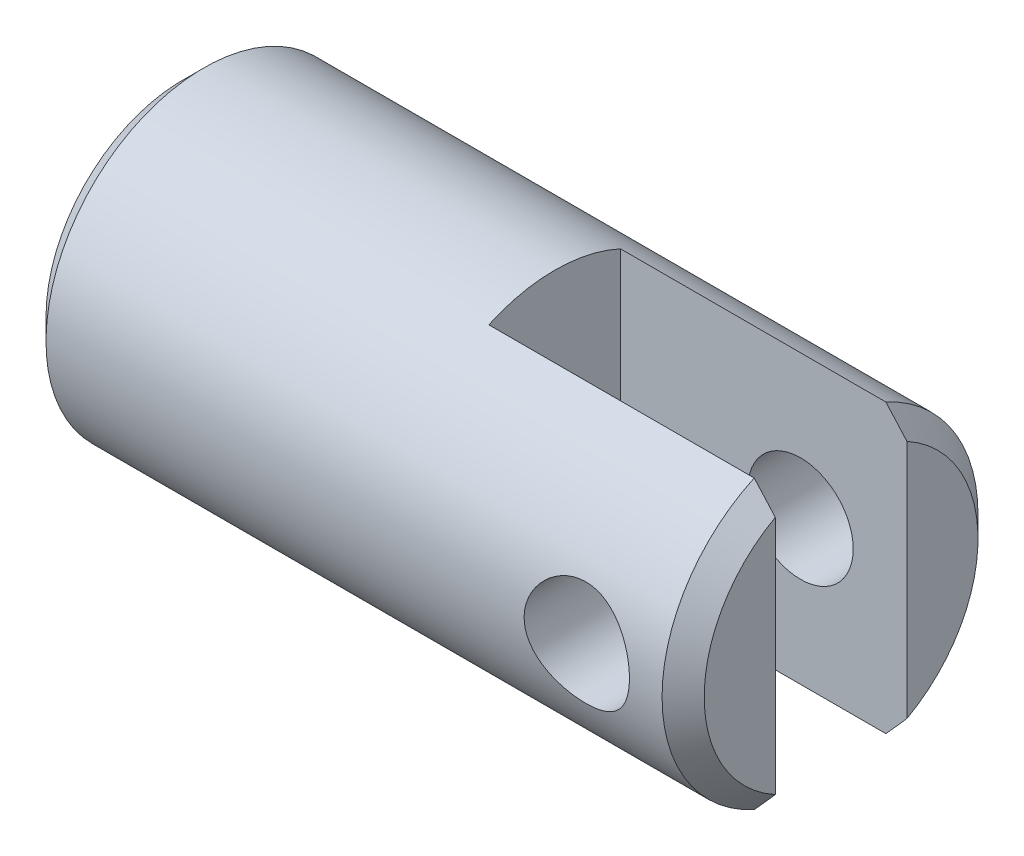
ISO-10303-21;
HEADER;
FILE_DESCRIPTION(('STEP AP214'),'2;1');
FILE_NAME('part.step','',(''),(''),'','','');
FILE_SCHEMA(('AUTOMOTIVE_DESIGN { 1 0 10303 214 1 1 1 1 }'));
ENDSEC;
DATA;
#1=APPLICATION_CONTEXT('core data for automotive mechanical design processes');
#2=APPLICATION_PROTOCOL_DEFINITION('international standard','automotive_design',2000,#1);
#3=PRODUCT_CONTEXT('',#1,'mechanical');
#4=PRODUCT('Part','Part','',(#3));
#5=PRODUCT_RELATED_PRODUCT_CATEGORY('part','',(#4));
#6=PRODUCT_DEFINITION_FORMATION('','',#4);
#7=PRODUCT_DEFINITION_CONTEXT('part definition',#1,'design');
#8=PRODUCT_DEFINITION('design','',#6,#7);
#9=PRODUCT_DEFINITION_SHAPE('','',#8);
#10=(LENGTH_UNIT() NAMED_UNIT(*) SI_UNIT(.MILLI.,.METRE.));
#11=(NAMED_UNIT(*) PLANE_ANGLE_UNIT() SI_UNIT($,.RADIAN.));
#12=(NAMED_UNIT(*) SI_UNIT($,.STERADIAN.) SOLID_ANGLE_UNIT());
#13=UNCERTAINTY_MEASURE_WITH_UNIT(LENGTH_MEASURE(1.E-05),#10,'distance_accuracy_value','');
#14=(GEOMETRIC_REPRESENTATION_CONTEXT(3) GLOBAL_UNCERTAINTY_ASSIGNED_CONTEXT((#13)) GLOBAL_UNIT_ASSIGNED_CONTEXT((#10,
#11,#12)) REPRESENTATION_CONTEXT('',''));
#15=CARTESIAN_POINT('',(0.,0.,0.));
#16=DIRECTION('',(0.,0.,1.));
#17=DIRECTION('',(1.,0.,0.));
#18=AXIS2_PLACEMENT_3D('',#15,#16,#17);
#19=CARTESIAN_POINT('',(39.6875,0.,0.));
#20=DIRECTION('',(1.,0.,0.));
#21=DIRECTION('',(0.,0.,-1.));
#22=AXIS2_PLACEMENT_3D('',#19,#20,#21);
#23=PLANE('',#22);
#24=DIRECTION('',(0.,1.,0.));
#25=VECTOR('',#24,1.);
#26=CARTESIAN_POINT('',(39.6875,-8.6587902409921,-3.96875));
#27=LINE('',#26,#25);
#28=CARTESIAN_POINT('',(39.6875,-7.238373328138,-3.96875));
#29=VERTEX_POINT('',#28);
#30=CARTESIAN_POINT('',(39.6875,7.238373328138,-3.96875));
#31=VERTEX_POINT('',#30);
#32=EDGE_CURVE('E114',#29,#31,#27,.T.);
#33=ORIENTED_EDGE('',*,*,#32,.F.);
#34=CARTESIAN_POINT('',(39.6875,0.,0.));
#35=DIRECTION('',(1.,0.,0.));
#36=DIRECTION('',(0.,0.,-1.));
#37=AXIS2_PLACEMENT_3D('',#34,#35,#36);
#38=CIRCLE('',#37,8.25499999999998);
#39=EDGE_CURVE('E208',#29,#31,#38,.T.);
#40=ORIENTED_EDGE('',*,*,#39,.T.);
#41=EDGE_LOOP('',(#33,#40));
#42=FACE_BOUND('',#41,.T.);
#43=ADVANCED_FACE('F34',(#42),#23,.T.);
#44=CARTESIAN_POINT('',(39.6875,0.,0.));
#45=DIRECTION('',(-1.,0.,0.));
#46=DIRECTION('',(0.,0.,1.));
#47=AXIS2_PLACEMENT_3D('',#44,#45,#46);
#48=CYLINDRICAL_SURFACE('',#47,9.525);
#49=CARTESIAN_POINT('',(1.27000000000001,0.,0.));
#50=DIRECTION('',(1.,0.,0.));
#51=DIRECTION('',(0.,0.,-1.));
#52=AXIS2_PLACEMENT_3D('',#49,#50,#51);
#53=CIRCLE('',#52,9.525);
#54=CARTESIAN_POINT('',(1.27000000000001,0.,-9.525));
#55=VERTEX_POINT('',#54);
#56=EDGE_CURVE('E133',#55,#55,#53,.T.);
#57=ORIENTED_EDGE('',*,*,#56,.T.);
#58=EDGE_LOOP('',(#57));
#59=FACE_BOUND('',#58,.T.);
#60=CARTESIAN_POINT('',(36.449,0.,-9.525));
#61=CARTESIAN_POINT('',(36.449000805598,0.173238677165346,-9.52500048580498));
#62=CARTESIAN_POINT('',(36.4347751550461,0.346472492659895,-9.52023018186455));
#63=CARTESIAN_POINT('',(36.3784225795053,0.687837590771685,-9.50167042395416));
#64=CARTESIAN_POINT('',(36.3362927579622,0.855968341777245,-9.48788003366834));
#65=CARTESIAN_POINT('',(36.2257364022556,1.18215660666814,-9.45277852602955));
#66=CARTESIAN_POINT('',(36.1573538266918,1.34023044718816,-9.43147998545459));
#67=CARTESIAN_POINT('',(35.9964317762382,1.6426654243569,-9.3835361515256));
#68=CARTESIAN_POINT('',(35.9038875361167,1.78702384834389,-9.35688980370195));
#69=CARTESIAN_POINT('',(35.6939030695735,2.06292981819569,-9.30002249856541));
#70=CARTESIAN_POINT('',(35.5757758312229,2.19393674844713,-9.26971591772517));
#71=CARTESIAN_POINT('',(35.3194392838066,2.43469379932912,-9.20941499436411));
#72=CARTESIAN_POINT('',(35.181225564102,2.54443923892904,-9.17942072197493));
#73=CARTESIAN_POINT('',(34.8837722592512,2.74264419157345,-9.12219830615344));
#74=CARTESIAN_POINT('',(34.7240423763505,2.83040092485178,-9.0950744970031));
#75=CARTESIAN_POINT('',(34.3910409000941,2.97757492456176,-9.04796594704059));
#76=CARTESIAN_POINT('',(34.2177734580083,3.03700083920298,-9.02797902810367));
#77=CARTESIAN_POINT('',(33.8687625217479,3.12379824029159,-8.99830887880273));
#78=CARTESIAN_POINT('',(33.6932993630472,3.15218269826286,-8.98830104068516));
#79=CARTESIAN_POINT('',(33.3398375805551,3.17925806658696,-8.97876209798686));
#80=CARTESIAN_POINT('',(33.1618397572483,3.17795815259498,-8.97922775597168));
#81=CARTESIAN_POINT('',(32.8170011983402,3.14648819425835,-8.99029872650972));
#82=CARTESIAN_POINT('',(32.6500223207321,3.1176401743052,-9.00043970379417));
#83=CARTESIAN_POINT('',(32.3234258927483,3.03404956704689,-9.02895888275449));
#84=CARTESIAN_POINT('',(32.1638092262436,2.97930387942919,-9.04733807064542));
#85=CARTESIAN_POINT('',(31.853464520047,2.84460650934116,-9.09059367841715));
#86=CARTESIAN_POINT('',(31.7029210191343,2.76426310464555,-9.11556996393148));
#87=CARTESIAN_POINT('',(31.4170348662119,2.58092291251246,-9.16916373477931));
#88=CARTESIAN_POINT('',(31.2816966219865,2.47791958175572,-9.19778227084722));
#89=CARTESIAN_POINT('',(31.0226341758395,2.2458341312661,-9.25726270107577));
#90=CARTESIAN_POINT('',(30.8998851949337,2.11567125149229,-9.28816371201626));
#91=CARTESIAN_POINT('',(30.6777032283437,1.83622813465495,-9.34742029378842));
#92=CARTESIAN_POINT('',(30.5782724788277,1.68694606622309,-9.37577562033364));
#93=CARTESIAN_POINT('',(30.4047642467537,1.3714336714219,-9.42711817702495));
#94=CARTESIAN_POINT('',(30.3309480649932,1.20504990262187,-9.45004936275525));
#95=CARTESIAN_POINT('',(30.2126549226906,0.861279339682312,-9.4875530068358));
#96=CARTESIAN_POINT('',(30.1681677705306,0.683896391141978,-9.50212836854242));
#97=CARTESIAN_POINT('',(30.111523260379,0.331418658755541,-9.52079715951823));
#98=CARTESIAN_POINT('',(30.0980481058765,0.156557979570887,-9.52531755822087));
#99=CARTESIAN_POINT('',(30.1000562386751,-0.192960847123753,-9.52464766056077));
#100=CARTESIAN_POINT('',(30.1155346379361,-0.367619023839889,-9.51945900331475));
#101=CARTESIAN_POINT('',(30.1739678070617,-0.706500575516011,-9.50023578476806));
#102=CARTESIAN_POINT('',(30.2161137042071,-0.870879661700629,-9.48646180908036));
#103=CARTESIAN_POINT('',(30.3256741861819,-1.19016766849015,-9.45171613685472));
#104=CARTESIAN_POINT('',(30.3930919933102,-1.34507537851482,-9.43074352248193));
#105=CARTESIAN_POINT('',(30.5532486210945,-1.64556534104864,-9.38304356837145));
#106=CARTESIAN_POINT('',(30.6466068336741,-1.79079512051444,-9.35617936849621));
#107=CARTESIAN_POINT('',(30.8552664262928,-2.06395583568048,-9.29974181184133));
#108=CARTESIAN_POINT('',(30.9705745079009,-2.19188146775095,-9.27016762910402));
#109=CARTESIAN_POINT('',(31.2260575344459,-2.432851712285,-9.20993992337912));
#110=CARTESIAN_POINT('',(31.3671242954928,-2.54495607735532,-9.17929841452584));
#111=CARTESIAN_POINT('',(31.6667247277996,-2.74401763337735,-9.121774152107));
#112=CARTESIAN_POINT('',(31.8252585446632,-2.83097461468096,-9.09489142987857));
#113=CARTESIAN_POINT('',(32.1553618235454,-2.97687025407194,-9.04819093937643));
#114=CARTESIAN_POINT('',(32.3269041013608,-3.03586556962394,-9.02835890517708));
#115=CARTESIAN_POINT('',(32.6783022138901,-3.12386556696095,-8.99829392572977));
#116=CARTESIAN_POINT('',(32.8581542651588,-3.15288375947876,-8.98805665630055));
#117=CARTESIAN_POINT('',(33.2111257799299,-3.17905219686556,-8.97883201925513));
#118=CARTESIAN_POINT('',(33.3841164304107,-3.17776306695416,-8.97929370817293));
#119=CARTESIAN_POINT('',(33.7272791128775,-3.1471942816996,-8.99005281690779));
#120=CARTESIAN_POINT('',(33.8974513120074,-3.11791629228101,-9.00034965132723));
#121=CARTESIAN_POINT('',(34.2269307300328,-3.03330550668567,-9.02920864668031));
#122=CARTESIAN_POINT('',(34.3863829193893,-2.97847812359925,-9.04761011221366));
#123=CARTESIAN_POINT('',(34.693947017029,-2.84473448628719,-9.09054566248638));
#124=CARTESIAN_POINT('',(34.8420563990219,-2.76581288515833,-9.11508110823773));
#125=CARTESIAN_POINT('',(35.1297356520052,-2.58210269895239,-9.16885482792697));
#126=CARTESIAN_POINT('',(35.2686508935274,-2.47633567077755,-9.19825159463785));
#127=CARTESIAN_POINT('',(35.5272651574948,-2.24359115395569,-9.25777156199328));
#128=CARTESIAN_POINT('',(35.6469587278096,-2.11660766813346,-9.28789496596782));
#129=CARTESIAN_POINT('',(35.8684335090181,-1.83909194322319,-9.34688346918603));
#130=CARTESIAN_POINT('',(35.9693348041094,-1.68783480536164,-9.3756537721899));
#131=CARTESIAN_POINT('',(36.1441696116008,-1.36955960976603,-9.42740021973043));
#132=CARTESIAN_POINT('',(36.2181100183025,-1.2025455950702,-9.45037784507677));
#133=CARTESIAN_POINT('',(36.3338161831515,-0.865167329863096,-9.4870751034262));
#134=CARTESIAN_POINT('',(36.3768718303862,-0.695286130622597,-9.50116249441509));
#135=CARTESIAN_POINT('',(36.4344593911499,-0.350267320832535,-9.52012342428904));
#136=CARTESIAN_POINT('',(36.4489991856015,-0.17513117618077,-9.52499950888798));
#137=CARTESIAN_POINT('',(36.449,0.,-9.525));
#138=B_SPLINE_CURVE_WITH_KNOTS('',3,(#60,#61,#62,#63,#64,#65,#66,#67,#68,#69,#70,#71,#72,#73,
#74,#75,#76,#77,#78,#79,#80,#81,#82,#83,#84,#85,#86,#87,#88,#89,#90,#91,#92,#93,#94,#95,#96,#97,
#98,#99,#100,#101,#102,#103,#104,#105,#106,#107,#108,#109,#110,#111,#112,#113,#114,#115,#116,
#117,#118,#119,#120,#121,#122,#123,#124,#125,#126,#127,#128,#129,#130,#131,#132,#133,#134,#135,
#136,#137),.UNSPECIFIED.,.T.,.F.,(4,2,2,2,2,2,2,2,2,2,2,2,2,2,2,2,2,2,2,2,2,2,2,2,2,2,2,2,2,2,2,
2,2,2,2,2,2,2,4),(0.,0.519071561632583,1.03819701322438,1.55645698636311,2.07481924951214,
2.6093637259775,3.14402575687909,3.69406121814519,4.24392866899746,4.77526114230341,
5.30642937910266,5.81332424300315,6.32027980466156,6.8353994341754,7.35066800622307,
7.89283745951089,8.43505888444012,8.98265937939884,9.53006948685135,10.0537512658116,
10.5773446429626,11.0857715158083,11.5942632377703,12.1161301950386,12.638156741095,
13.1839024764639,13.7296527614611,14.2742924389999,14.8186865394104,15.3351123975402,
15.8515075194062,16.3580948898032,16.8647947620873,17.3936046174648,17.92256420318,
18.4721392315144,19.0215736265905,19.5464607283686,20.0712027467109),.UNSPECIFIED.);
#139=CARTESIAN_POINT('',(36.449,0.,-9.525));
#140=VERTEX_POINT('',#139);
#141=EDGE_CURVE('E187',#140,#140,#138,.T.);
#142=ORIENTED_EDGE('',*,*,#141,.T.);
#143=EDGE_LOOP('',(#142));
#144=FACE_BOUND('',#143,.T.);
#145=CARTESIAN_POINT('',(36.449,0.,9.52499999999999));
#146=CARTESIAN_POINT('',(36.449000805598,-0.173238677165346,9.52500048580497));
#147=CARTESIAN_POINT('',(36.4347751550461,-0.346472492659896,9.52023018186455));
#148=CARTESIAN_POINT('',(36.3784225795053,-0.687837590771687,9.50167042395417));
#149=CARTESIAN_POINT('',(36.3362927579622,-0.855968341777246,9.48788003366834));
#150=CARTESIAN_POINT('',(36.2257364022556,-1.18215660666814,9.45277852602955));
#151=CARTESIAN_POINT('',(36.1573538266918,-1.34023044718816,9.43147998545459));
#152=CARTESIAN_POINT('',(35.9964317762382,-1.64266542435691,9.3835361515256));
#153=CARTESIAN_POINT('',(35.9038875361167,-1.78702384834389,9.35688980370195));
#154=CARTESIAN_POINT('',(35.6939030695735,-2.0629298181957,9.30002249856541));
#155=CARTESIAN_POINT('',(35.5757758312229,-2.19393674844713,9.26971591772517));
#156=CARTESIAN_POINT('',(35.3194392838066,-2.43469379932912,9.20941499436411));
#157=CARTESIAN_POINT('',(35.181225564102,-2.54443923892904,9.17942072197493));
#158=CARTESIAN_POINT('',(34.8837722592512,-2.74264419157345,9.12219830615344));
#159=CARTESIAN_POINT('',(34.7240423763505,-2.83040092485178,9.0950744970031));
#160=CARTESIAN_POINT('',(34.3910409000941,-2.97757492456176,9.04796594704059));
#161=CARTESIAN_POINT('',(34.2177734580083,-3.03700083920298,9.02797902810367));
#162=CARTESIAN_POINT('',(33.8687625217479,-3.12379824029159,8.99830887880273));
#163=CARTESIAN_POINT('',(33.6932993630472,-3.15218269826286,8.98830104068516));
#164=CARTESIAN_POINT('',(33.3398375805551,-3.17925806658696,8.97876209798686));
#165=CARTESIAN_POINT('',(33.1618397572483,-3.17795815259498,8.97922775597168));
#166=CARTESIAN_POINT('',(32.8170011983402,-3.14648819425835,8.99029872650972));
#167=CARTESIAN_POINT('',(32.6500223207321,-3.1176401743052,9.00043970379417));
#168=CARTESIAN_POINT('',(32.3234258927483,-3.03404956704689,9.02895888275449));
#169=CARTESIAN_POINT('',(32.1638092262436,-2.97930387942919,9.04733807064542));
#170=CARTESIAN_POINT('',(31.853464520047,-2.84460650934116,9.09059367841715));
#171=CARTESIAN_POINT('',(31.7029210191343,-2.76426310464555,9.11556996393148));
#172=CARTESIAN_POINT('',(31.4170348662119,-2.58092291251246,9.16916373477932));
#173=CARTESIAN_POINT('',(31.2816966219865,-2.47791958175571,9.19778227084722));
#174=CARTESIAN_POINT('',(31.0226341758395,-2.2458341312661,9.25726270107577));
#175=CARTESIAN_POINT('',(30.8998851949337,-2.11567125149229,9.28816371201626));
#176=CARTESIAN_POINT('',(30.6777032283437,-1.83622813465495,9.34742029378842));
#177=CARTESIAN_POINT('',(30.5782724788277,-1.68694606622308,9.37577562033364));
#178=CARTESIAN_POINT('',(30.4047642467537,-1.3714336714219,9.42711817702495));
#179=CARTESIAN_POINT('',(30.3309480649932,-1.20504990262187,9.45004936275525));
#180=CARTESIAN_POINT('',(30.2126549226906,-0.861279339682311,9.4875530068358));
#181=CARTESIAN_POINT('',(30.1681677705306,-0.683896391141977,9.50212836854242));
#182=CARTESIAN_POINT('',(30.111523260379,-0.331418658755539,9.52079715951823));
#183=CARTESIAN_POINT('',(30.0980481058765,-0.156557979570885,9.52531755822087));
#184=CARTESIAN_POINT('',(30.1000562386751,0.192960847123755,9.52464766056077));
#185=CARTESIAN_POINT('',(30.1155346379361,0.367619023839891,9.51945900331475));
#186=CARTESIAN_POINT('',(30.1739678070617,0.706500575516013,9.50023578476806));
#187=CARTESIAN_POINT('',(30.2161137042071,0.87087966170063,9.48646180908036));
#188=CARTESIAN_POINT('',(30.3256741861819,1.19016766849015,9.45171613685472));
#189=CARTESIAN_POINT('',(30.3930919933102,1.34507537851483,9.43074352248193));
#190=CARTESIAN_POINT('',(30.5532486210945,1.64556534104864,9.38304356837145));
#191=CARTESIAN_POINT('',(30.6466068336741,1.79079512051444,9.35617936849621));
#192=CARTESIAN_POINT('',(30.8552664262928,2.06395583568049,9.29974181184133));
#193=CARTESIAN_POINT('',(30.9705745079009,2.19188146775096,9.27016762910402));
#194=CARTESIAN_POINT('',(31.2260575344459,2.432851712285,9.20993992337912));
#195=CARTESIAN_POINT('',(31.3671242954928,2.54495607735532,9.17929841452584));
#196=CARTESIAN_POINT('',(31.6667247277996,2.74401763337735,9.121774152107));
#197=CARTESIAN_POINT('',(31.8252585446632,2.83097461468096,9.09489142987857));
#198=CARTESIAN_POINT('',(32.1553618235454,2.97687025407194,9.04819093937643));
#199=CARTESIAN_POINT('',(32.3269041013608,3.03586556962394,9.02835890517708));
#200=CARTESIAN_POINT('',(32.6783022138901,3.12386556696095,8.99829392572977));
#201=CARTESIAN_POINT('',(32.8581542651588,3.15288375947876,8.98805665630055));
#202=CARTESIAN_POINT('',(33.2111257799299,3.17905219686556,8.97883201925513));
#203=CARTESIAN_POINT('',(33.3841164304107,3.17776306695416,8.97929370817293));
#204=CARTESIAN_POINT('',(33.7272791128775,3.1471942816996,8.99005281690779));
#205=CARTESIAN_POINT('',(33.8974513120074,3.11791629228101,9.00034965132723));
#206=CARTESIAN_POINT('',(34.2269307300328,3.03330550668567,9.02920864668031));
#207=CARTESIAN_POINT('',(34.3863829193893,2.97847812359925,9.04761011221366));
#208=CARTESIAN_POINT('',(34.693947017029,2.84473448628719,9.09054566248638));
#209=CARTESIAN_POINT('',(34.8420563990219,2.76581288515833,9.11508110823773));
#210=CARTESIAN_POINT('',(35.1297356520052,2.58210269895239,9.16885482792697));
#211=CARTESIAN_POINT('',(35.2686508935274,2.47633567077754,9.19825159463785));
#212=CARTESIAN_POINT('',(35.5272651574948,2.24359115395568,9.25777156199328));
#213=CARTESIAN_POINT('',(35.6469587278096,2.11660766813345,9.28789496596782));
#214=CARTESIAN_POINT('',(35.8684335090181,1.83909194322319,9.34688346918603));
#215=CARTESIAN_POINT('',(35.9693348041094,1.68783480536164,9.3756537721899));
#216=CARTESIAN_POINT('',(36.1441696116008,1.36955960976603,9.42740021973043));
#217=CARTESIAN_POINT('',(36.2181100183025,1.2025455950702,9.45037784507677));
#218=CARTESIAN_POINT('',(36.3338161831515,0.865167329863095,9.48707510342621));
#219=CARTESIAN_POINT('',(36.3768718303862,0.695286130622595,9.5011624944151));
#220=CARTESIAN_POINT('',(36.4344593911499,0.350267320832533,9.52012342428904));
#221=CARTESIAN_POINT('',(36.4489991856015,0.175131176180769,9.52499950888797));
#222=CARTESIAN_POINT('',(36.449,0.,9.52499999999999));
#223=B_SPLINE_CURVE_WITH_KNOTS('',3,(#145,#146,#147,#148,#149,#150,#151,#152,#153,#154,#155,
#156,#157,#158,#159,#160,#161,#162,#163,#164,#165,#166,#167,#168,#169,#170,#171,#172,#173,#174,
#175,#176,#177,#178,#179,#180,#181,#182,#183,#184,#185,#186,#187,#188,#189,#190,#191,#192,#193,
#194,#195,#196,#197,#198,#199,#200,#201,#202,#203,#204,#205,#206,#207,#208,#209,#210,#211,#212,
#213,#214,#215,#216,#217,#218,#219,#220,#221,#222),.UNSPECIFIED.,.T.,.F.,(4,2,2,2,2,2,2,2,2,2,2,
2,2,2,2,2,2,2,2,2,2,2,2,2,2,2,2,2,2,2,2,2,2,2,2,2,2,2,4),(0.,0.519071561632585,1.03819701322438,
1.55645698636312,2.07481924951214,2.6093637259775,3.14402575687909,3.69406121814519,
4.24392866899746,4.77526114230341,5.30642937910266,5.81332424300315,6.32027980466156,
6.8353994341754,7.35066800622308,7.8928374595109,8.43505888444012,8.98265937939884,
9.53006948685135,10.0537512658116,10.5773446429626,11.0857715158083,11.5942632377703,
12.1161301950386,12.638156741095,13.1839024764639,13.7296527614611,14.2742924389999,
14.8186865394104,15.3351123975402,15.8515075194062,16.3580948898032,16.8647947620873,
17.3936046174648,17.92256420318,18.4721392315144,19.0215736265905,19.5464607283686,
20.0712027467109),.UNSPECIFIED.);
#224=CARTESIAN_POINT('',(36.449,0.,9.52499999999999));
#225=VERTEX_POINT('',#224);
#226=EDGE_CURVE('E180',#225,#225,#223,.T.);
#227=ORIENTED_EDGE('',*,*,#226,.T.);
#228=EDGE_LOOP('',(#227));
#229=FACE_BOUND('',#228,.T.);
#230=DIRECTION('',(1.,0.,0.));
#231=VECTOR('',#230,1.);
#232=CARTESIAN_POINT('',(22.4155,-8.6587902409921,3.96875));
#233=LINE('',#232,#231);
#234=CARTESIAN_POINT('',(22.4155,-8.6587902409921,3.96875));
#235=VERTEX_POINT('',#234);
#236=CARTESIAN_POINT('',(38.4175,-8.6587902409921,3.96875));
#237=VERTEX_POINT('',#236);
#238=EDGE_CURVE('E101',#235,#237,#233,.T.);
#239=ORIENTED_EDGE('',*,*,#238,.T.);
#240=CARTESIAN_POINT('',(38.4175,0.,0.));
#241=DIRECTION('',(1.,0.,0.));
#242=DIRECTION('',(0.,0.,-1.));
#243=AXIS2_PLACEMENT_3D('',#240,#241,#242);
#244=CIRCLE('',#243,9.525);
#245=CARTESIAN_POINT('',(38.4175,8.6587902409921,3.96875));
#246=VERTEX_POINT('',#245);
#247=EDGE_CURVE('E118',#237,#246,#244,.F.);
#248=ORIENTED_EDGE('',*,*,#247,.T.);
#249=DIRECTION('',(1.,0.,0.));
#250=VECTOR('',#249,1.);
#251=CARTESIAN_POINT('',(22.4155,8.6587902409921,3.96875));
#252=LINE('',#251,#250);
#253=CARTESIAN_POINT('',(22.4155,8.6587902409921,3.96875));
#254=VERTEX_POINT('',#253);
#255=EDGE_CURVE('E98',#254,#246,#252,.T.);
#256=ORIENTED_EDGE('',*,*,#255,.F.);
#257=CARTESIAN_POINT('',(22.4155,0.,0.));
#258=DIRECTION('',(1.,0.,0.));
#259=DIRECTION('',(0.,0.,-1.));
#260=AXIS2_PLACEMENT_3D('',#257,#258,#259);
#261=CIRCLE('',#260,9.525);
#262=CARTESIAN_POINT('',(22.4155,8.6587902409921,-3.96875));
#263=VERTEX_POINT('',#262);
#264=EDGE_CURVE('E105',#263,#254,#261,.T.);
#265=ORIENTED_EDGE('',*,*,#264,.F.);
#266=DIRECTION('',(1.,0.,0.));
#267=VECTOR('',#266,1.);
#268=CARTESIAN_POINT('',(22.4155,8.6587902409921,-3.96875));
#269=LINE('',#268,#267);
#270=CARTESIAN_POINT('',(38.4175,8.6587902409921,-3.96875));
#271=VERTEX_POINT('',#270);
#272=EDGE_CURVE('E131',#263,#271,#269,.T.);
#273=ORIENTED_EDGE('',*,*,#272,.T.);
#274=CARTESIAN_POINT('',(38.4175,0.,0.));
#275=DIRECTION('',(1.,0.,0.));
#276=DIRECTION('',(0.,0.,-1.));
#277=AXIS2_PLACEMENT_3D('',#274,#275,#276);
#278=CIRCLE('',#277,9.525);
#279=CARTESIAN_POINT('',(38.4175,-8.6587902409921,-3.96875));
#280=VERTEX_POINT('',#279);
#281=EDGE_CURVE('E129',#271,#280,#278,.F.);
#282=ORIENTED_EDGE('',*,*,#281,.T.);
#283=DIRECTION('',(1.,0.,0.));
#284=VECTOR('',#283,1.);
#285=CARTESIAN_POINT('',(22.4155,-8.6587902409921,-3.96875));
#286=LINE('',#285,#284);
#287=CARTESIAN_POINT('',(22.4155,-8.6587902409921,-3.96875));
#288=VERTEX_POINT('',#287);
#289=EDGE_CURVE('E120',#288,#280,#286,.T.);
#290=ORIENTED_EDGE('',*,*,#289,.F.);
#291=CARTESIAN_POINT('',(22.4155,0.,0.));
#292=DIRECTION('',(1.,0.,0.));
#293=DIRECTION('',(0.,0.,-1.));
#294=AXIS2_PLACEMENT_3D('',#291,#292,#293);
#295=CIRCLE('',#294,9.525);
#296=EDGE_CURVE('E104',#235,#288,#295,.T.);
#297=ORIENTED_EDGE('',*,*,#296,.F.);
#298=EDGE_LOOP('',(#239,#248,#256,#265,#273,#282,#290,#297));
#299=FACE_BOUND('',#298,.T.);
#300=ADVANCED_FACE('F116',(#59,#144,#229,#299),#48,.T.);
#301=DIRECTION('',(0.,-1.,0.));
#302=VECTOR('',#301,1.);
#303=CARTESIAN_POINT('',(39.6875,8.6587902409921,3.96875));
#304=LINE('',#303,#302);
#305=CARTESIAN_POINT('',(39.6875,7.238373328138,3.96875));
#306=VERTEX_POINT('',#305);
#307=CARTESIAN_POINT('',(39.6875,-7.238373328138,3.96875));
#308=VERTEX_POINT('',#307);
#309=EDGE_CURVE('E192',#306,#308,#304,.T.);
#310=ORIENTED_EDGE('',*,*,#309,.F.);
#311=CARTESIAN_POINT('',(39.6875,0.,0.));
#312=DIRECTION('',(1.,0.,0.));
#313=DIRECTION('',(0.,0.,-1.));
#314=AXIS2_PLACEMENT_3D('',#311,#312,#313);
#315=CIRCLE('',#314,8.25499999999998);
#316=EDGE_CURVE('E139',#306,#308,#315,.T.);
#317=ORIENTED_EDGE('',*,*,#316,.T.);
#318=EDGE_LOOP('',(#310,#317));
#319=FACE_BOUND('',#318,.T.);
#320=ADVANCED_FACE('F165',(#319),#23,.T.);
#321=CARTESIAN_POINT('',(0.,0.,0.));
#322=DIRECTION('',(1.,0.,0.));
#323=DIRECTION('',(0.,0.,-1.));
#324=AXIS2_PLACEMENT_3D('',#321,#322,#323);
#325=PLANE('',#324);
#326=CARTESIAN_POINT('',(0.,0.,0.));
#327=DIRECTION('',(1.,0.,0.));
#328=DIRECTION('',(0.,0.,-1.));
#329=AXIS2_PLACEMENT_3D('',#326,#327,#328);
#330=CIRCLE('',#329,8.25499999999998);
#331=CARTESIAN_POINT('',(0.,0.,-8.25499999999998));
#332=VERTEX_POINT('',#331);
#333=EDGE_CURVE('E136',#332,#332,#330,.F.);
#334=ORIENTED_EDGE('',*,*,#333,.T.);
#335=EDGE_LOOP('',(#334));
#336=FACE_BOUND('',#335,.T.);
#337=ADVANCED_FACE('F169',(#336),#325,.F.);
#338=CARTESIAN_POINT('',(22.4155,-8.6587902409921,-3.96875));
#339=DIRECTION('',(0.,0.,-1.));
#340=DIRECTION('',(-1.,0.,0.));
#341=AXIS2_PLACEMENT_3D('',#338,#339,#340);
#342=PLANE('',#341);
#343=CARTESIAN_POINT('',(33.274,0.,-3.96875));
#344=DIRECTION('',(0.,0.,-1.));
#345=DIRECTION('',(-1.,0.,0.));
#346=AXIS2_PLACEMENT_3D('',#343,#344,#345);
#347=CIRCLE('',#346,3.175);
#348=CARTESIAN_POINT('',(30.099,0.,-3.96875));
#349=VERTEX_POINT('',#348);
#350=EDGE_CURVE('E128',#349,#349,#347,.T.);
#351=ORIENTED_EDGE('',*,*,#350,.T.);
#352=EDGE_LOOP('',(#351));
#353=FACE_BOUND('',#352,.T.);
#354=ORIENTED_EDGE('',*,*,#32,.T.);
#355=CARTESIAN_POINT('',(39.6875,7.238373328138,-3.96875));
#356=CARTESIAN_POINT('',(39.582811591401,7.35776096709702,-3.96875));
#357=CARTESIAN_POINT('',(39.4777893200169,7.47685515838941,-3.96875));
#358=CARTESIAN_POINT('',(39.2671521128822,7.71451414919927,-3.96875));
#359=CARTESIAN_POINT('',(39.1615371889559,7.83307895919474,-3.96875));
#360=CARTESIAN_POINT('',(38.9497859943266,8.06974095851595,-3.96875));
#361=CARTESIAN_POINT('',(38.8436497257174,8.18783814971643,-3.96875));
#362=CARTESIAN_POINT('',(38.6309102830091,8.42361556230968,-3.96875));
#363=CARTESIAN_POINT('',(38.5243070996771,8.54129577537304,-3.96875));
#364=CARTESIAN_POINT('',(38.4175,8.6587902409921,-3.96875));
#365=B_SPLINE_CURVE_WITH_KNOTS('',3,(#355,#356,#357,#358,#359,#360,#361,#362,#363,#364),
.UNSPECIFIED.,.F.,.F.,(4,2,2,2,4),(0.,0.476357362425002,0.952705254187973,1.42905123428182,
1.90540667664287),.UNSPECIFIED.);
#366=EDGE_CURVE('E11',#31,#271,#365,.T.);
#367=ORIENTED_EDGE('',*,*,#366,.T.);
#368=ORIENTED_EDGE('',*,*,#272,.F.);
#369=DIRECTION('',(0.,1.,0.));
#370=VECTOR('',#369,1.);
#371=CARTESIAN_POINT('',(22.4155,-8.6587902409921,-3.96875));
#372=LINE('',#371,#370);
#373=EDGE_CURVE('E111',#288,#263,#372,.T.);
#374=ORIENTED_EDGE('',*,*,#373,.F.);
#375=ORIENTED_EDGE('',*,*,#289,.T.);
#376=CARTESIAN_POINT('',(38.4175,-8.6587902409921,-3.96875));
#377=CARTESIAN_POINT('',(38.5243070996771,-8.54129577537304,-3.96875));
#378=CARTESIAN_POINT('',(38.6309102830091,-8.42361556230968,-3.96875));
#379=CARTESIAN_POINT('',(38.8436497257174,-8.18783814971643,-3.96875));
#380=CARTESIAN_POINT('',(38.9497859943266,-8.06974095851595,-3.96875));
#381=CARTESIAN_POINT('',(39.1615371889559,-7.83307895919474,-3.96875));
#382=CARTESIAN_POINT('',(39.2671521128822,-7.71451414919927,-3.96875));
#383=CARTESIAN_POINT('',(39.4777893200169,-7.47685515838941,-3.96875));
#384=CARTESIAN_POINT('',(39.582811591401,-7.35776096709702,-3.96875));
#385=CARTESIAN_POINT('',(39.6875,-7.23837332813801,-3.96875));
#386=B_SPLINE_CURVE_WITH_KNOTS('',3,(#376,#377,#378,#379,#380,#381,#382,#383,#384,#385),
.UNSPECIFIED.,.F.,.F.,(4,2,2,2,4),(0.,0.476355442361045,0.952701422454901,1.42904931421787,
1.90540667664288),.UNSPECIFIED.);
#387=EDGE_CURVE('E48',#280,#29,#386,.T.);
#388=ORIENTED_EDGE('',*,*,#387,.T.);
#389=EDGE_LOOP('',(#354,#367,#368,#374,#375,#388));
#390=FACE_BOUND('',#389,.T.);
#391=ADVANCED_FACE('F161',(#353,#390),#342,.F.);
#392=CARTESIAN_POINT('',(22.4155,8.6587902409921,3.96875));
#393=DIRECTION('',(0.,0.,1.));
#394=DIRECTION('',(1.,0.,0.));
#395=AXIS2_PLACEMENT_3D('',#392,#393,#394);
#396=PLANE('',#395);
#397=CARTESIAN_POINT('',(33.274,0.,3.96875));
#398=DIRECTION('',(0.,0.,1.));
#399=DIRECTION('',(1.,0.,0.));
#400=AXIS2_PLACEMENT_3D('',#397,#398,#399);
#401=CIRCLE('',#400,3.175);
#402=CARTESIAN_POINT('',(36.449,0.,3.96875));
#403=VERTEX_POINT('',#402);
#404=EDGE_CURVE('E125',#403,#403,#401,.T.);
#405=ORIENTED_EDGE('',*,*,#404,.T.);
#406=EDGE_LOOP('',(#405));
#407=FACE_BOUND('',#406,.T.);
#408=ORIENTED_EDGE('',*,*,#309,.T.);
#409=CARTESIAN_POINT('',(39.6875,-7.238373328138,3.96875));
#410=CARTESIAN_POINT('',(39.582811591401,-7.35776096709702,3.96875));
#411=CARTESIAN_POINT('',(39.4777893200169,-7.47685515838941,3.96875));
#412=CARTESIAN_POINT('',(39.2671521128822,-7.71451414919927,3.96875));
#413=CARTESIAN_POINT('',(39.1615371889559,-7.83307895919474,3.96875));
#414=CARTESIAN_POINT('',(38.9497859943266,-8.06974095851595,3.96875));
#415=CARTESIAN_POINT('',(38.8436497257174,-8.18783814971643,3.96875));
#416=CARTESIAN_POINT('',(38.6309102830091,-8.42361556230968,3.96875));
#417=CARTESIAN_POINT('',(38.5243070996771,-8.54129577537304,3.96875));
#418=CARTESIAN_POINT('',(38.4175,-8.6587902409921,3.96875));
#419=B_SPLINE_CURVE_WITH_KNOTS('',3,(#409,#410,#411,#412,#413,#414,#415,#416,#417,#418),
.UNSPECIFIED.,.F.,.F.,(4,2,2,2,4),(0.,0.476357362425002,0.952705254187973,1.42905123428182,
1.90540667664287),.UNSPECIFIED.);
#420=EDGE_CURVE('E149',#308,#237,#419,.T.);
#421=ORIENTED_EDGE('',*,*,#420,.T.);
#422=ORIENTED_EDGE('',*,*,#238,.F.);
#423=DIRECTION('',(0.,-1.,0.));
#424=VECTOR('',#423,1.);
#425=CARTESIAN_POINT('',(22.4155,8.6587902409921,3.96875));
#426=LINE('',#425,#424);
#427=EDGE_CURVE('E93',#254,#235,#426,.T.);
#428=ORIENTED_EDGE('',*,*,#427,.F.);
#429=ORIENTED_EDGE('',*,*,#255,.T.);
#430=CARTESIAN_POINT('',(38.4175,8.6587902409921,3.96875));
#431=CARTESIAN_POINT('',(38.5243070996771,8.54129577537304,3.96875));
#432=CARTESIAN_POINT('',(38.6309102830091,8.42361556230968,3.96875));
#433=CARTESIAN_POINT('',(38.8436497257174,8.18783814971643,3.96875));
#434=CARTESIAN_POINT('',(38.9497859943266,8.06974095851595,3.96875));
#435=CARTESIAN_POINT('',(39.1615371889559,7.83307895919474,3.96875));
#436=CARTESIAN_POINT('',(39.2671521128822,7.71451414919927,3.96875));
#437=CARTESIAN_POINT('',(39.4777893200169,7.47685515838941,3.96875));
#438=CARTESIAN_POINT('',(39.582811591401,7.35776096709702,3.96875));
#439=CARTESIAN_POINT('',(39.6875,7.23837332813801,3.96875));
#440=B_SPLINE_CURVE_WITH_KNOTS('',3,(#430,#431,#432,#433,#434,#435,#436,#437,#438,#439),
.UNSPECIFIED.,.F.,.F.,(4,2,2,2,4),(0.,0.476355442361045,0.952701422454901,1.42904931421787,
1.90540667664288),.UNSPECIFIED.);
#441=EDGE_CURVE('E142',#246,#306,#440,.T.);
#442=ORIENTED_EDGE('',*,*,#441,.T.);
#443=EDGE_LOOP('',(#408,#421,#422,#428,#429,#442));
#444=FACE_BOUND('',#443,.T.);
#445=ADVANCED_FACE('F96',(#407,#444),#396,.F.);
#446=CARTESIAN_POINT('',(22.4155,0.,0.));
#447=DIRECTION('',(1.,0.,0.));
#448=DIRECTION('',(0.,0.,-1.));
#449=AXIS2_PLACEMENT_3D('',#446,#447,#448);
#450=PLANE('',#449);
#451=ORIENTED_EDGE('',*,*,#264,.T.);
#452=ORIENTED_EDGE('',*,*,#427,.T.);
#453=ORIENTED_EDGE('',*,*,#296,.T.);
#454=ORIENTED_EDGE('',*,*,#373,.T.);
#455=EDGE_LOOP('',(#451,#452,#453,#454));
#456=FACE_BOUND('',#455,.T.);
#457=ADVANCED_FACE('F109',(#456),#450,.T.);
#458=CARTESIAN_POINT('',(33.274,0.,-9.525));
#459=DIRECTION('',(0.,0.,1.));
#460=DIRECTION('',(1.,0.,0.));
#461=AXIS2_PLACEMENT_3D('',#458,#459,#460);
#462=CYLINDRICAL_SURFACE('',#461,3.175);
#463=ORIENTED_EDGE('',*,*,#404,.F.);
#464=EDGE_LOOP('',(#463));
#465=FACE_BOUND('',#464,.T.);
#466=ORIENTED_EDGE('',*,*,#226,.F.);
#467=EDGE_LOOP('',(#466));
#468=FACE_BOUND('',#467,.T.);
#469=ADVANCED_FACE('F196',(#465,#468),#462,.F.);
#470=ORIENTED_EDGE('',*,*,#350,.F.);
#471=EDGE_LOOP('',(#470));
#472=FACE_BOUND('',#471,.T.);
#473=ORIENTED_EDGE('',*,*,#141,.F.);
#474=EDGE_LOOP('',(#473));
#475=FACE_BOUND('',#474,.T.);
#476=ADVANCED_FACE('F193',(#472,#475),#462,.F.);
#477=CARTESIAN_POINT('',(1.27000000000001,0.,0.));
#478=DIRECTION('',(1.,0.,0.));
#479=DIRECTION('',(0.,0.,-1.));
#480=AXIS2_PLACEMENT_3D('',#477,#478,#479);
#481=CONICAL_SURFACE('',#480,9.525,0.785398163397454);
#482=ORIENTED_EDGE('',*,*,#333,.F.);
#483=EDGE_LOOP('',(#482));
#484=FACE_BOUND('',#483,.T.);
#485=ORIENTED_EDGE('',*,*,#56,.F.);
#486=EDGE_LOOP('',(#485));
#487=FACE_BOUND('',#486,.T.);
#488=ADVANCED_FACE('F177',(#484,#487),#481,.T.);
#489=CARTESIAN_POINT('',(39.6875,0.,0.));
#490=DIRECTION('',(-1.,0.,0.));
#491=DIRECTION('',(0.,0.,1.));
#492=AXIS2_PLACEMENT_3D('',#489,#490,#491);
#493=CONICAL_SURFACE('',#492,8.25499999999998,0.785398163397454);
#494=ORIENTED_EDGE('',*,*,#441,.F.);
#495=ORIENTED_EDGE('',*,*,#247,.F.);
#496=ORIENTED_EDGE('',*,*,#420,.F.);
#497=ORIENTED_EDGE('',*,*,#316,.F.);
#498=EDGE_LOOP('',(#494,#495,#496,#497));
#499=FACE_BOUND('',#498,.T.);
#500=ADVANCED_FACE('F155',(#499),#493,.T.);
#501=CARTESIAN_POINT('',(39.6875,0.,0.));
#502=DIRECTION('',(-1.,0.,0.));
#503=DIRECTION('',(0.,0.,1.));
#504=AXIS2_PLACEMENT_3D('',#501,#502,#503);
#505=CONICAL_SURFACE('',#504,8.25499999999998,0.785398163397454);
#506=ORIENTED_EDGE('',*,*,#387,.F.);
#507=ORIENTED_EDGE('',*,*,#281,.F.);
#508=ORIENTED_EDGE('',*,*,#366,.F.);
#509=ORIENTED_EDGE('',*,*,#39,.F.);
#510=EDGE_LOOP('',(#506,#507,#508,#509));
#511=FACE_BOUND('',#510,.T.);
#512=ADVANCED_FACE('F36',(#511),#505,.T.);
#513=CLOSED_SHELL('',(#43,#300,#320,#337,#391,#445,#457,#469,#476,#488,#500,#512));
#514=MANIFOLD_SOLID_BREP('B2',#513);
#515=ADVANCED_BREP_SHAPE_REPRESENTATION('',(#18,#514),#14);
#516=SHAPE_DEFINITION_REPRESENTATION(#9,#515);
ENDSEC;
END-ISO-10303-21;
